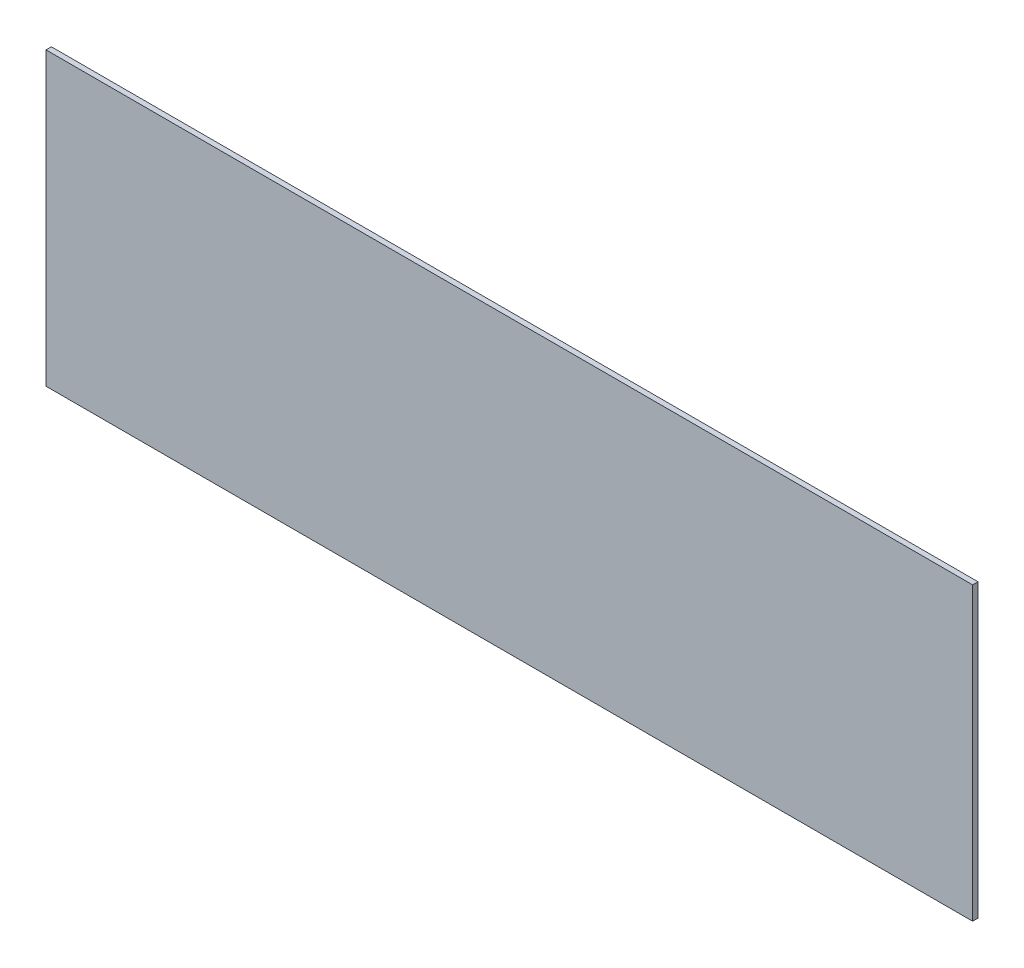
ISO-10303-21;
HEADER;
FILE_DESCRIPTION(('STEP AP214'),'2;1');
FILE_NAME('part.step','',(''),(''),'','','');
FILE_SCHEMA(('AUTOMOTIVE_DESIGN { 1 0 10303 214 1 1 1 1 }'));
ENDSEC;
DATA;
#1=APPLICATION_CONTEXT('core data for automotive mechanical design processes');
#2=APPLICATION_PROTOCOL_DEFINITION('international standard','automotive_design',2000,#1);
#3=PRODUCT_CONTEXT('',#1,'mechanical');
#4=PRODUCT('Part','Part','',(#3));
#5=PRODUCT_RELATED_PRODUCT_CATEGORY('part','',(#4));
#6=PRODUCT_DEFINITION_FORMATION('','',#4);
#7=PRODUCT_DEFINITION_CONTEXT('part definition',#1,'design');
#8=PRODUCT_DEFINITION('design','',#6,#7);
#9=PRODUCT_DEFINITION_SHAPE('','',#8);
#10=(LENGTH_UNIT() NAMED_UNIT(*) SI_UNIT(.MILLI.,.METRE.));
#11=(NAMED_UNIT(*) PLANE_ANGLE_UNIT() SI_UNIT($,.RADIAN.));
#12=(NAMED_UNIT(*) SI_UNIT($,.STERADIAN.) SOLID_ANGLE_UNIT());
#13=UNCERTAINTY_MEASURE_WITH_UNIT(LENGTH_MEASURE(1.E-05),#10,'distance_accuracy_value','');
#14=(GEOMETRIC_REPRESENTATION_CONTEXT(3) GLOBAL_UNCERTAINTY_ASSIGNED_CONTEXT((#13)) GLOBAL_UNIT_ASSIGNED_CONTEXT((#10,
#11,#12)) REPRESENTATION_CONTEXT('',''));
#15=CARTESIAN_POINT('',(0.,0.,0.));
#16=DIRECTION('',(0.,0.,1.));
#17=DIRECTION('',(1.,0.,0.));
#18=AXIS2_PLACEMENT_3D('',#15,#16,#17);
#19=CARTESIAN_POINT('',(0.,0.,0.24));
#20=DIRECTION('',(1.,0.,0.));
#21=DIRECTION('',(0.,0.,-1.));
#22=AXIS2_PLACEMENT_3D('',#19,#20,#21);
#23=PLANE('',#22);
#24=DIRECTION('',(0.,-1.,0.));
#25=VECTOR('',#24,1.);
#26=CARTESIAN_POINT('',(0.,0.,0.));
#27=LINE('',#26,#25);
#28=CARTESIAN_POINT('',(0.,13.,0.));
#29=VERTEX_POINT('',#28);
#30=CARTESIAN_POINT('',(0.,0.,0.));
#31=VERTEX_POINT('',#30);
#32=EDGE_CURVE('E103',#29,#31,#27,.T.);
#33=ORIENTED_EDGE('',*,*,#32,.T.);
#34=DIRECTION('',(0.,0.,-1.));
#35=VECTOR('',#34,1.);
#36=CARTESIAN_POINT('',(0.,0.,0.24));
#37=LINE('',#36,#35);
#38=CARTESIAN_POINT('',(0.,0.,0.24));
#39=VERTEX_POINT('',#38);
#40=EDGE_CURVE('E11',#39,#31,#37,.T.);
#41=ORIENTED_EDGE('',*,*,#40,.F.);
#42=DIRECTION('',(0.,-1.,0.));
#43=VECTOR('',#42,1.);
#44=CARTESIAN_POINT('',(0.,0.,0.24));
#45=LINE('',#44,#43);
#46=CARTESIAN_POINT('',(0.,13.,0.24));
#47=VERTEX_POINT('',#46);
#48=EDGE_CURVE('E89',#47,#39,#45,.T.);
#49=ORIENTED_EDGE('',*,*,#48,.F.);
#50=DIRECTION('',(0.,0.,-1.));
#51=VECTOR('',#50,1.);
#52=CARTESIAN_POINT('',(0.,13.,0.24));
#53=LINE('',#52,#51);
#54=EDGE_CURVE('E99',#47,#29,#53,.T.);
#55=ORIENTED_EDGE('',*,*,#54,.T.);
#56=EDGE_LOOP('',(#33,#41,#49,#55));
#57=FACE_BOUND('',#56,.T.);
#58=ADVANCED_FACE('F38',(#57),#23,.F.);
#59=CARTESIAN_POINT('',(0.,0.,0.24));
#60=DIRECTION('',(0.,1.,0.));
#61=DIRECTION('',(0.,0.,1.));
#62=AXIS2_PLACEMENT_3D('',#59,#60,#61);
#63=PLANE('',#62);
#64=DIRECTION('',(1.,0.,0.));
#65=VECTOR('',#64,1.);
#66=CARTESIAN_POINT('',(0.,0.,0.));
#67=LINE('',#66,#65);
#68=CARTESIAN_POINT('',(41.35,0.,0.));
#69=VERTEX_POINT('',#68);
#70=EDGE_CURVE('E94',#31,#69,#67,.T.);
#71=ORIENTED_EDGE('',*,*,#70,.T.);
#72=DIRECTION('',(0.,0.,-1.));
#73=VECTOR('',#72,1.);
#74=CARTESIAN_POINT('',(41.35,0.,0.24));
#75=LINE('',#74,#73);
#76=CARTESIAN_POINT('',(41.35,0.,0.24));
#77=VERTEX_POINT('',#76);
#78=EDGE_CURVE('E46',#77,#69,#75,.T.);
#79=ORIENTED_EDGE('',*,*,#78,.F.);
#80=DIRECTION('',(1.,0.,0.));
#81=VECTOR('',#80,1.);
#82=CARTESIAN_POINT('',(0.,0.,0.24));
#83=LINE('',#82,#81);
#84=EDGE_CURVE('E84',#39,#77,#83,.T.);
#85=ORIENTED_EDGE('',*,*,#84,.F.);
#86=ORIENTED_EDGE('',*,*,#40,.T.);
#87=EDGE_LOOP('',(#71,#79,#85,#86));
#88=FACE_BOUND('',#87,.T.);
#89=ADVANCED_FACE('F93',(#88),#63,.F.);
#90=CARTESIAN_POINT('',(41.35,0.,0.24));
#91=DIRECTION('',(-1.,0.,0.));
#92=DIRECTION('',(0.,0.,1.));
#93=AXIS2_PLACEMENT_3D('',#90,#91,#92);
#94=PLANE('',#93);
#95=DIRECTION('',(0.,1.,0.));
#96=VECTOR('',#95,1.);
#97=CARTESIAN_POINT('',(41.35,0.,0.));
#98=LINE('',#97,#96);
#99=CARTESIAN_POINT('',(41.35,13.,0.));
#100=VERTEX_POINT('',#99);
#101=EDGE_CURVE('E71',#69,#100,#98,.T.);
#102=ORIENTED_EDGE('',*,*,#101,.T.);
#103=DIRECTION('',(0.,0.,-1.));
#104=VECTOR('',#103,1.);
#105=CARTESIAN_POINT('',(41.35,13.,0.24));
#106=LINE('',#105,#104);
#107=CARTESIAN_POINT('',(41.35,13.,0.24));
#108=VERTEX_POINT('',#107);
#109=EDGE_CURVE('E95',#108,#100,#106,.T.);
#110=ORIENTED_EDGE('',*,*,#109,.F.);
#111=DIRECTION('',(0.,1.,0.));
#112=VECTOR('',#111,1.);
#113=CARTESIAN_POINT('',(41.35,0.,0.24));
#114=LINE('',#113,#112);
#115=EDGE_CURVE('E87',#77,#108,#114,.T.);
#116=ORIENTED_EDGE('',*,*,#115,.F.);
#117=ORIENTED_EDGE('',*,*,#78,.T.);
#118=EDGE_LOOP('',(#102,#110,#116,#117));
#119=FACE_BOUND('',#118,.T.);
#120=ADVANCED_FACE('F96',(#119),#94,.F.);
#121=CARTESIAN_POINT('',(0.,13.,0.24));
#122=DIRECTION('',(0.,-1.,0.));
#123=DIRECTION('',(0.,0.,-1.));
#124=AXIS2_PLACEMENT_3D('',#121,#122,#123);
#125=PLANE('',#124);
#126=DIRECTION('',(-1.,0.,0.));
#127=VECTOR('',#126,1.);
#128=CARTESIAN_POINT('',(0.,13.,0.));
#129=LINE('',#128,#127);
#130=EDGE_CURVE('E77',#100,#29,#129,.T.);
#131=ORIENTED_EDGE('',*,*,#130,.T.);
#132=ORIENTED_EDGE('',*,*,#54,.F.);
#133=DIRECTION('',(-1.,0.,0.));
#134=VECTOR('',#133,1.);
#135=CARTESIAN_POINT('',(0.,13.,0.24));
#136=LINE('',#135,#134);
#137=EDGE_CURVE('E54',#108,#47,#136,.T.);
#138=ORIENTED_EDGE('',*,*,#137,.F.);
#139=ORIENTED_EDGE('',*,*,#109,.T.);
#140=EDGE_LOOP('',(#131,#132,#138,#139));
#141=FACE_BOUND('',#140,.T.);
#142=ADVANCED_FACE('F111',(#141),#125,.F.);
#143=CARTESIAN_POINT('',(0.,0.,0.24));
#144=DIRECTION('',(0.,0.,-1.));
#145=DIRECTION('',(-1.,0.,0.));
#146=AXIS2_PLACEMENT_3D('',#143,#144,#145);
#147=PLANE('',#146);
#148=ORIENTED_EDGE('',*,*,#48,.T.);
#149=ORIENTED_EDGE('',*,*,#84,.T.);
#150=ORIENTED_EDGE('',*,*,#115,.T.);
#151=ORIENTED_EDGE('',*,*,#137,.T.);
#152=EDGE_LOOP('',(#148,#149,#150,#151));
#153=FACE_BOUND('',#152,.T.);
#154=ADVANCED_FACE('F85',(#153),#147,.F.);
#155=CARTESIAN_POINT('',(0.,0.,0.));
#156=DIRECTION('',(0.,0.,-1.));
#157=DIRECTION('',(-1.,0.,0.));
#158=AXIS2_PLACEMENT_3D('',#155,#156,#157);
#159=PLANE('',#158);
#160=ORIENTED_EDGE('',*,*,#32,.F.);
#161=ORIENTED_EDGE('',*,*,#130,.F.);
#162=ORIENTED_EDGE('',*,*,#101,.F.);
#163=ORIENTED_EDGE('',*,*,#70,.F.);
#164=EDGE_LOOP('',(#160,#161,#162,#163));
#165=FACE_BOUND('',#164,.T.);
#166=ADVANCED_FACE('F114',(#165),#159,.T.);
#167=CLOSED_SHELL('',(#58,#89,#120,#142,#154,#166));
#168=MANIFOLD_SOLID_BREP('B2',#167);
#169=ADVANCED_BREP_SHAPE_REPRESENTATION('',(#18,#168),#14);
#170=SHAPE_DEFINITION_REPRESENTATION(#9,#169);
ENDSEC;
END-ISO-10303-21;
